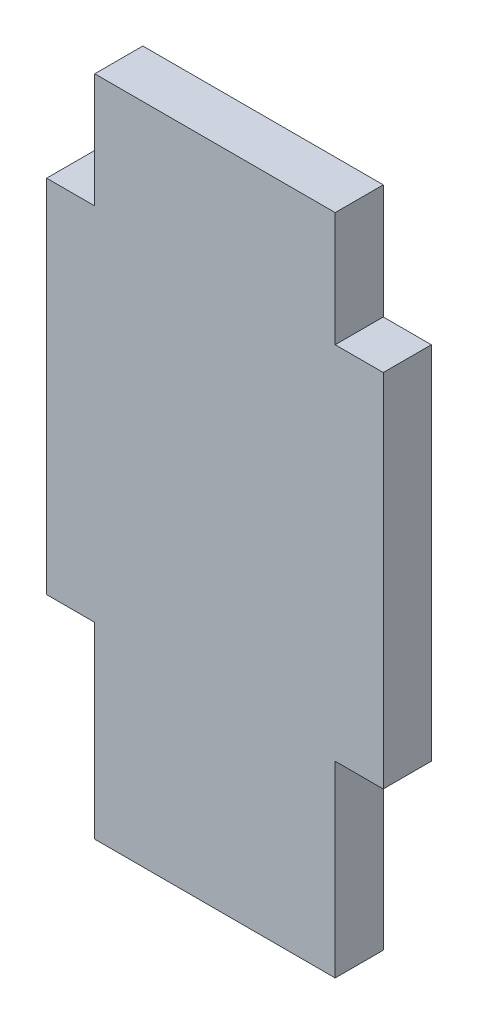
ISO-10303-21;
HEADER;
FILE_DESCRIPTION(('STEP AP214'),'2;1');
FILE_NAME('part.step','',(''),(''),'','','');
FILE_SCHEMA(('AUTOMOTIVE_DESIGN { 1 0 10303 214 1 1 1 1 }'));
ENDSEC;
DATA;
#1=APPLICATION_CONTEXT('core data for automotive mechanical design processes');
#2=APPLICATION_PROTOCOL_DEFINITION('international standard','automotive_design',2000,#1);
#3=PRODUCT_CONTEXT('',#1,'mechanical');
#4=PRODUCT('Part','Part','',(#3));
#5=PRODUCT_RELATED_PRODUCT_CATEGORY('part','',(#4));
#6=PRODUCT_DEFINITION_FORMATION('','',#4);
#7=PRODUCT_DEFINITION_CONTEXT('part definition',#1,'design');
#8=PRODUCT_DEFINITION('design','',#6,#7);
#9=PRODUCT_DEFINITION_SHAPE('','',#8);
#10=(LENGTH_UNIT() NAMED_UNIT(*) SI_UNIT(.MILLI.,.METRE.));
#11=(NAMED_UNIT(*) PLANE_ANGLE_UNIT() SI_UNIT($,.RADIAN.));
#12=(NAMED_UNIT(*) SI_UNIT($,.STERADIAN.) SOLID_ANGLE_UNIT());
#13=UNCERTAINTY_MEASURE_WITH_UNIT(LENGTH_MEASURE(1.E-05),#10,'distance_accuracy_value','');
#14=(GEOMETRIC_REPRESENTATION_CONTEXT(3) GLOBAL_UNCERTAINTY_ASSIGNED_CONTEXT((#13)) GLOBAL_UNIT_ASSIGNED_CONTEXT((#10,
#11,#12)) REPRESENTATION_CONTEXT('',''));
#15=CARTESIAN_POINT('',(0.,0.,0.));
#16=DIRECTION('',(0.,0.,1.));
#17=DIRECTION('',(1.,0.,0.));
#18=AXIS2_PLACEMENT_3D('',#15,#16,#17);
#19=CARTESIAN_POINT('',(18.1671687906472,102.945208252911,5.08));
#20=DIRECTION('',(0.,-1.,0.));
#21=DIRECTION('',(0.,0.,-1.));
#22=AXIS2_PLACEMENT_3D('',#19,#20,#21);
#23=PLANE('',#22);
#24=DIRECTION('',(-1.,0.,0.));
#25=VECTOR('',#24,1.);
#26=CARTESIAN_POINT('',(18.1671687906472,102.945208252911,0.));
#27=LINE('',#26,#25);
#28=CARTESIAN_POINT('',(18.1671687906472,102.945208252911,0.));
#29=VERTEX_POINT('',#28);
#30=CARTESIAN_POINT('',(13.0871687906472,102.945208252911,0.));
#31=VERTEX_POINT('',#30);
#32=EDGE_CURVE('E171',#29,#31,#27,.T.);
#33=ORIENTED_EDGE('',*,*,#32,.F.);
#34=DIRECTION('',(0.,0.,-1.));
#35=VECTOR('',#34,1.);
#36=CARTESIAN_POINT('',(18.1671687906472,102.945208252911,5.08));
#37=LINE('',#36,#35);
#38=CARTESIAN_POINT('',(18.1671687906472,102.945208252911,5.08));
#39=VERTEX_POINT('',#38);
#40=EDGE_CURVE('E11',#39,#29,#37,.T.);
#41=ORIENTED_EDGE('',*,*,#40,.F.);
#42=DIRECTION('',(-1.,0.,0.));
#43=VECTOR('',#42,1.);
#44=CARTESIAN_POINT('',(18.1671687906472,102.945208252911,5.08));
#45=LINE('',#44,#43);
#46=CARTESIAN_POINT('',(13.0871687906472,102.945208252911,5.08));
#47=VERTEX_POINT('',#46);
#48=EDGE_CURVE('E201',#39,#47,#45,.T.);
#49=ORIENTED_EDGE('',*,*,#48,.T.);
#50=DIRECTION('',(0.,0.,-1.));
#51=VECTOR('',#50,1.);
#52=CARTESIAN_POINT('',(13.0871687906472,102.945208252911,5.08));
#53=LINE('',#52,#51);
#54=EDGE_CURVE('E36',#47,#31,#53,.T.);
#55=ORIENTED_EDGE('',*,*,#54,.T.);
#56=EDGE_LOOP('',(#33,#41,#49,#55));
#57=FACE_BOUND('',#56,.T.);
#58=ADVANCED_FACE('F33',(#57),#23,.T.);
#59=CARTESIAN_POINT('',(18.1671687906472,95.3054468690553,5.08));
#60=DIRECTION('',(-1.,0.,0.));
#61=DIRECTION('',(0.,0.,1.));
#62=AXIS2_PLACEMENT_3D('',#59,#60,#61);
#63=PLANE('',#62);
#64=DIRECTION('',(0.,1.,0.));
#65=VECTOR('',#64,1.);
#66=CARTESIAN_POINT('',(18.1671687906472,95.3054468690553,0.));
#67=LINE('',#66,#65);
#68=CARTESIAN_POINT('',(18.1671687906472,83.1134468690553,0.));
#69=VERTEX_POINT('',#68);
#70=EDGE_CURVE('E88',#69,#29,#67,.T.);
#71=ORIENTED_EDGE('',*,*,#70,.F.);
#72=DIRECTION('',(0.,0.,-1.));
#73=VECTOR('',#72,1.);
#74=CARTESIAN_POINT('',(18.1671687906472,83.1134468690553,5.08));
#75=LINE('',#74,#73);
#76=CARTESIAN_POINT('',(18.1671687906472,83.1134468690553,5.08));
#77=VERTEX_POINT('',#76);
#78=EDGE_CURVE('E42',#77,#69,#75,.T.);
#79=ORIENTED_EDGE('',*,*,#78,.F.);
#80=DIRECTION('',(0.,-1.,0.));
#81=VECTOR('',#80,1.);
#82=CARTESIAN_POINT('',(18.1671687906472,95.3054468690553,5.08));
#83=LINE('',#82,#81);
#84=EDGE_CURVE('E50',#39,#77,#83,.T.);
#85=ORIENTED_EDGE('',*,*,#84,.F.);
#86=ORIENTED_EDGE('',*,*,#40,.T.);
#87=EDGE_LOOP('',(#71,#79,#85,#86));
#88=FACE_BOUND('',#87,.T.);
#89=ADVANCED_FACE('F258',(#88),#63,.T.);
#90=CARTESIAN_POINT('',(18.1671687906472,83.1134468690553,5.08));
#91=DIRECTION('',(0.,1.,0.));
#92=DIRECTION('',(0.,0.,1.));
#93=AXIS2_PLACEMENT_3D('',#90,#91,#92);
#94=PLANE('',#93);
#95=DIRECTION('',(1.,0.,0.));
#96=VECTOR('',#95,1.);
#97=CARTESIAN_POINT('',(18.1671687906472,83.1134468690553,0.));
#98=LINE('',#97,#96);
#99=CARTESIAN_POINT('',(43.567168790647,83.1134468690553,0.));
#100=VERTEX_POINT('',#99);
#101=EDGE_CURVE('E147',#69,#100,#98,.T.);
#102=ORIENTED_EDGE('',*,*,#101,.T.);
#103=DIRECTION('',(0.,0.,-1.));
#104=VECTOR('',#103,1.);
#105=CARTESIAN_POINT('',(43.567168790647,83.1134468690553,5.08));
#106=LINE('',#105,#104);
#107=CARTESIAN_POINT('',(43.567168790647,83.1134468690553,5.08));
#108=VERTEX_POINT('',#107);
#109=EDGE_CURVE('E130',#108,#100,#106,.T.);
#110=ORIENTED_EDGE('',*,*,#109,.F.);
#111=DIRECTION('',(1.,0.,0.));
#112=VECTOR('',#111,1.);
#113=CARTESIAN_POINT('',(18.1671687906472,83.1134468690553,5.08));
#114=LINE('',#113,#112);
#115=EDGE_CURVE('E137',#77,#108,#114,.T.);
#116=ORIENTED_EDGE('',*,*,#115,.F.);
#117=ORIENTED_EDGE('',*,*,#78,.T.);
#118=EDGE_LOOP('',(#102,#110,#116,#117));
#119=FACE_BOUND('',#118,.T.);
#120=ADVANCED_FACE('F145',(#119),#94,.F.);
#121=CARTESIAN_POINT('',(43.567168790647,83.1134468690553,5.08));
#122=DIRECTION('',(-1.,0.,0.));
#123=DIRECTION('',(0.,0.,1.));
#124=AXIS2_PLACEMENT_3D('',#121,#122,#123);
#125=PLANE('',#124);
#126=DIRECTION('',(0.,1.,0.));
#127=VECTOR('',#126,1.);
#128=CARTESIAN_POINT('',(43.567168790647,83.1134468690553,0.));
#129=LINE('',#128,#127);
#130=CARTESIAN_POINT('',(43.567168790647,102.945208252911,0.));
#131=VERTEX_POINT('',#130);
#132=EDGE_CURVE('E198',#100,#131,#129,.T.);
#133=ORIENTED_EDGE('',*,*,#132,.T.);
#134=DIRECTION('',(0.,0.,-1.));
#135=VECTOR('',#134,1.);
#136=CARTESIAN_POINT('',(43.567168790647,102.945208252911,5.08));
#137=LINE('',#136,#135);
#138=CARTESIAN_POINT('',(43.567168790647,102.945208252911,5.08));
#139=VERTEX_POINT('',#138);
#140=EDGE_CURVE('E133',#139,#131,#137,.T.);
#141=ORIENTED_EDGE('',*,*,#140,.F.);
#142=DIRECTION('',(0.,-1.,0.));
#143=VECTOR('',#142,1.);
#144=CARTESIAN_POINT('',(43.567168790647,102.945208252911,5.08));
#145=LINE('',#144,#143);
#146=EDGE_CURVE('E126',#139,#108,#145,.T.);
#147=ORIENTED_EDGE('',*,*,#146,.T.);
#148=ORIENTED_EDGE('',*,*,#109,.T.);
#149=EDGE_LOOP('',(#133,#141,#147,#148));
#150=FACE_BOUND('',#149,.T.);
#151=ADVANCED_FACE('F128',(#150),#125,.F.);
#152=CARTESIAN_POINT('',(48.647168790647,102.945208252911,5.08));
#153=DIRECTION('',(0.,-1.,0.));
#154=DIRECTION('',(0.,0.,-1.));
#155=AXIS2_PLACEMENT_3D('',#152,#153,#154);
#156=PLANE('',#155);
#157=DIRECTION('',(-1.,0.,0.));
#158=VECTOR('',#157,1.);
#159=CARTESIAN_POINT('',(48.647168790647,102.945208252911,0.));
#160=LINE('',#159,#158);
#161=CARTESIAN_POINT('',(48.647168790647,102.945208252911,0.));
#162=VERTEX_POINT('',#161);
#163=EDGE_CURVE('E195',#162,#131,#160,.T.);
#164=ORIENTED_EDGE('',*,*,#163,.F.);
#165=DIRECTION('',(0.,0.,-1.));
#166=VECTOR('',#165,1.);
#167=CARTESIAN_POINT('',(48.647168790647,102.945208252911,5.08));
#168=LINE('',#167,#166);
#169=CARTESIAN_POINT('',(48.647168790647,102.945208252911,5.08));
#170=VERTEX_POINT('',#169);
#171=EDGE_CURVE('E150',#170,#162,#168,.T.);
#172=ORIENTED_EDGE('',*,*,#171,.F.);
#173=DIRECTION('',(-1.,0.,0.));
#174=VECTOR('',#173,1.);
#175=CARTESIAN_POINT('',(48.647168790647,102.945208252911,5.08));
#176=LINE('',#175,#174);
#177=EDGE_CURVE('E138',#170,#139,#176,.T.);
#178=ORIENTED_EDGE('',*,*,#177,.T.);
#179=ORIENTED_EDGE('',*,*,#140,.T.);
#180=EDGE_LOOP('',(#164,#172,#178,#179));
#181=FACE_BOUND('',#180,.T.);
#182=ADVANCED_FACE('F225',(#181),#156,.T.);
#183=CARTESIAN_POINT('',(48.647168790647,141.045208252911,5.08));
#184=DIRECTION('',(1.,0.,0.));
#185=DIRECTION('',(0.,0.,-1.));
#186=AXIS2_PLACEMENT_3D('',#183,#184,#185);
#187=PLANE('',#186);
#188=DIRECTION('',(0.,-1.,0.));
#189=VECTOR('',#188,1.);
#190=CARTESIAN_POINT('',(48.647168790647,141.045208252911,0.));
#191=LINE('',#190,#189);
#192=CARTESIAN_POINT('',(48.647168790647,141.045208252911,0.));
#193=VERTEX_POINT('',#192);
#194=EDGE_CURVE('E192',#193,#162,#191,.T.);
#195=ORIENTED_EDGE('',*,*,#194,.F.);
#196=DIRECTION('',(0.,0.,-1.));
#197=VECTOR('',#196,1.);
#198=CARTESIAN_POINT('',(48.647168790647,141.045208252911,5.08));
#199=LINE('',#198,#197);
#200=CARTESIAN_POINT('',(48.647168790647,141.045208252911,5.08));
#201=VERTEX_POINT('',#200);
#202=EDGE_CURVE('E154',#201,#193,#199,.T.);
#203=ORIENTED_EDGE('',*,*,#202,.F.);
#204=DIRECTION('',(0.,-1.,0.));
#205=VECTOR('',#204,1.);
#206=CARTESIAN_POINT('',(48.647168790647,141.045208252911,5.08));
#207=LINE('',#206,#205);
#208=EDGE_CURVE('E220',#201,#170,#207,.T.);
#209=ORIENTED_EDGE('',*,*,#208,.T.);
#210=ORIENTED_EDGE('',*,*,#171,.T.);
#211=EDGE_LOOP('',(#195,#203,#209,#210));
#212=FACE_BOUND('',#211,.T.);
#213=ADVANCED_FACE('F229',(#212),#187,.T.);
#214=CARTESIAN_POINT('',(48.647168790647,141.045208252911,5.08));
#215=DIRECTION('',(0.,-1.,0.));
#216=DIRECTION('',(0.,0.,-1.));
#217=AXIS2_PLACEMENT_3D('',#214,#215,#216);
#218=PLANE('',#217);
#219=DIRECTION('',(-1.,0.,0.));
#220=VECTOR('',#219,1.);
#221=CARTESIAN_POINT('',(48.647168790647,141.045208252911,0.));
#222=LINE('',#221,#220);
#223=CARTESIAN_POINT('',(43.567168790647,141.045208252911,0.));
#224=VERTEX_POINT('',#223);
#225=EDGE_CURVE('E189',#193,#224,#222,.T.);
#226=ORIENTED_EDGE('',*,*,#225,.T.);
#227=DIRECTION('',(0.,0.,-1.));
#228=VECTOR('',#227,1.);
#229=CARTESIAN_POINT('',(43.567168790647,141.045208252911,5.08));
#230=LINE('',#229,#228);
#231=CARTESIAN_POINT('',(43.567168790647,141.045208252911,5.08));
#232=VERTEX_POINT('',#231);
#233=EDGE_CURVE('E156',#232,#224,#230,.T.);
#234=ORIENTED_EDGE('',*,*,#233,.F.);
#235=DIRECTION('',(-1.,0.,0.));
#236=VECTOR('',#235,1.);
#237=CARTESIAN_POINT('',(48.647168790647,141.045208252911,5.08));
#238=LINE('',#237,#236);
#239=EDGE_CURVE('E217',#201,#232,#238,.T.);
#240=ORIENTED_EDGE('',*,*,#239,.F.);
#241=ORIENTED_EDGE('',*,*,#202,.T.);
#242=EDGE_LOOP('',(#226,#234,#240,#241));
#243=FACE_BOUND('',#242,.T.);
#244=ADVANCED_FACE('F234',(#243),#218,.F.);
#245=CARTESIAN_POINT('',(43.567168790647,146.023259367157,5.08));
#246=DIRECTION('',(1.,0.,0.));
#247=DIRECTION('',(0.,0.,-1.));
#248=AXIS2_PLACEMENT_3D('',#245,#246,#247);
#249=PLANE('',#248);
#250=DIRECTION('',(0.,-1.,0.));
#251=VECTOR('',#250,1.);
#252=CARTESIAN_POINT('',(43.567168790647,146.023259367157,0.));
#253=LINE('',#252,#251);
#254=CARTESIAN_POINT('',(43.567168790647,153.135259367157,0.));
#255=VERTEX_POINT('',#254);
#256=EDGE_CURVE('E186',#255,#224,#253,.T.);
#257=ORIENTED_EDGE('',*,*,#256,.F.);
#258=DIRECTION('',(0.,0.,-1.));
#259=VECTOR('',#258,1.);
#260=CARTESIAN_POINT('',(43.567168790647,153.135259367157,5.08));
#261=LINE('',#260,#259);
#262=CARTESIAN_POINT('',(43.567168790647,153.135259367157,5.08));
#263=VERTEX_POINT('',#262);
#264=EDGE_CURVE('E158',#263,#255,#261,.T.);
#265=ORIENTED_EDGE('',*,*,#264,.F.);
#266=DIRECTION('',(0.,-1.,0.));
#267=VECTOR('',#266,1.);
#268=CARTESIAN_POINT('',(43.567168790647,153.135259367157,5.08));
#269=LINE('',#268,#267);
#270=EDGE_CURVE('E215',#263,#232,#269,.T.);
#271=ORIENTED_EDGE('',*,*,#270,.T.);
#272=ORIENTED_EDGE('',*,*,#233,.T.);
#273=EDGE_LOOP('',(#257,#265,#271,#272));
#274=FACE_BOUND('',#273,.T.);
#275=ADVANCED_FACE('F277',(#274),#249,.T.);
#276=CARTESIAN_POINT('',(18.1671687906472,153.135259367157,5.08));
#277=DIRECTION('',(0.,1.,0.));
#278=DIRECTION('',(0.,0.,1.));
#279=AXIS2_PLACEMENT_3D('',#276,#277,#278);
#280=PLANE('',#279);
#281=DIRECTION('',(1.,0.,0.));
#282=VECTOR('',#281,1.);
#283=CARTESIAN_POINT('',(18.1671687906472,153.135259367157,0.));
#284=LINE('',#283,#282);
#285=CARTESIAN_POINT('',(18.1671687906472,153.135259367157,0.));
#286=VERTEX_POINT('',#285);
#287=EDGE_CURVE('E183',#286,#255,#284,.T.);
#288=ORIENTED_EDGE('',*,*,#287,.F.);
#289=DIRECTION('',(0.,0.,-1.));
#290=VECTOR('',#289,1.);
#291=CARTESIAN_POINT('',(18.1671687906472,153.135259367157,5.08));
#292=LINE('',#291,#290);
#293=CARTESIAN_POINT('',(18.1671687906472,153.135259367157,5.08));
#294=VERTEX_POINT('',#293);
#295=EDGE_CURVE('E161',#294,#286,#292,.T.);
#296=ORIENTED_EDGE('',*,*,#295,.F.);
#297=DIRECTION('',(1.,0.,0.));
#298=VECTOR('',#297,1.);
#299=CARTESIAN_POINT('',(18.1671687906472,153.135259367157,5.08));
#300=LINE('',#299,#298);
#301=EDGE_CURVE('E212',#294,#263,#300,.T.);
#302=ORIENTED_EDGE('',*,*,#301,.T.);
#303=ORIENTED_EDGE('',*,*,#264,.T.);
#304=EDGE_LOOP('',(#288,#296,#302,#303));
#305=FACE_BOUND('',#304,.T.);
#306=ADVANCED_FACE('F242',(#305),#280,.T.);
#307=CARTESIAN_POINT('',(18.1671687906472,146.023259367157,5.08));
#308=DIRECTION('',(-1.,0.,0.));
#309=DIRECTION('',(0.,0.,1.));
#310=AXIS2_PLACEMENT_3D('',#307,#308,#309);
#311=PLANE('',#310);
#312=DIRECTION('',(0.,1.,0.));
#313=VECTOR('',#312,1.);
#314=CARTESIAN_POINT('',(18.1671687906472,146.023259367157,0.));
#315=LINE('',#314,#313);
#316=CARTESIAN_POINT('',(18.1671687906472,141.045208252911,0.));
#317=VERTEX_POINT('',#316);
#318=EDGE_CURVE('E180',#317,#286,#315,.T.);
#319=ORIENTED_EDGE('',*,*,#318,.F.);
#320=DIRECTION('',(0.,0.,-1.));
#321=VECTOR('',#320,1.);
#322=CARTESIAN_POINT('',(18.1671687906472,141.045208252911,5.08));
#323=LINE('',#322,#321);
#324=CARTESIAN_POINT('',(18.1671687906472,141.045208252911,5.08));
#325=VERTEX_POINT('',#324);
#326=EDGE_CURVE('E163',#325,#317,#323,.T.);
#327=ORIENTED_EDGE('',*,*,#326,.F.);
#328=DIRECTION('',(0.,1.,0.));
#329=VECTOR('',#328,1.);
#330=CARTESIAN_POINT('',(18.1671687906472,141.045208252911,5.08));
#331=LINE('',#330,#329);
#332=EDGE_CURVE('E210',#325,#294,#331,.T.);
#333=ORIENTED_EDGE('',*,*,#332,.T.);
#334=ORIENTED_EDGE('',*,*,#295,.T.);
#335=EDGE_LOOP('',(#319,#327,#333,#334));
#336=FACE_BOUND('',#335,.T.);
#337=ADVANCED_FACE('F244',(#336),#311,.T.);
#338=CARTESIAN_POINT('',(13.0871687906472,141.045208252911,5.08));
#339=DIRECTION('',(0.,1.,0.));
#340=DIRECTION('',(0.,0.,1.));
#341=AXIS2_PLACEMENT_3D('',#338,#339,#340);
#342=PLANE('',#341);
#343=DIRECTION('',(1.,0.,0.));
#344=VECTOR('',#343,1.);
#345=CARTESIAN_POINT('',(13.0871687906472,141.045208252911,0.));
#346=LINE('',#345,#344);
#347=CARTESIAN_POINT('',(13.0871687906472,141.045208252911,0.));
#348=VERTEX_POINT('',#347);
#349=EDGE_CURVE('E177',#348,#317,#346,.T.);
#350=ORIENTED_EDGE('',*,*,#349,.F.);
#351=DIRECTION('',(0.,0.,-1.));
#352=VECTOR('',#351,1.);
#353=CARTESIAN_POINT('',(13.0871687906472,141.045208252911,5.08));
#354=LINE('',#353,#352);
#355=CARTESIAN_POINT('',(13.0871687906472,141.045208252911,5.08));
#356=VERTEX_POINT('',#355);
#357=EDGE_CURVE('E165',#356,#348,#354,.T.);
#358=ORIENTED_EDGE('',*,*,#357,.F.);
#359=DIRECTION('',(1.,0.,0.));
#360=VECTOR('',#359,1.);
#361=CARTESIAN_POINT('',(13.0871687906472,141.045208252911,5.08));
#362=LINE('',#361,#360);
#363=EDGE_CURVE('E205',#356,#325,#362,.T.);
#364=ORIENTED_EDGE('',*,*,#363,.T.);
#365=ORIENTED_EDGE('',*,*,#326,.T.);
#366=EDGE_LOOP('',(#350,#358,#364,#365));
#367=FACE_BOUND('',#366,.T.);
#368=ADVANCED_FACE('F247',(#367),#342,.T.);
#369=CARTESIAN_POINT('',(13.0871687906472,102.945208252911,5.08));
#370=DIRECTION('',(-1.,0.,0.));
#371=DIRECTION('',(0.,0.,1.));
#372=AXIS2_PLACEMENT_3D('',#369,#370,#371);
#373=PLANE('',#372);
#374=DIRECTION('',(0.,1.,0.));
#375=VECTOR('',#374,1.);
#376=CARTESIAN_POINT('',(13.0871687906472,102.945208252911,0.));
#377=LINE('',#376,#375);
#378=EDGE_CURVE('E174',#31,#348,#377,.T.);
#379=ORIENTED_EDGE('',*,*,#378,.F.);
#380=ORIENTED_EDGE('',*,*,#54,.F.);
#381=DIRECTION('',(0.,1.,0.));
#382=VECTOR('',#381,1.);
#383=CARTESIAN_POINT('',(13.0871687906472,102.945208252911,5.08));
#384=LINE('',#383,#382);
#385=EDGE_CURVE('E203',#47,#356,#384,.T.);
#386=ORIENTED_EDGE('',*,*,#385,.T.);
#387=ORIENTED_EDGE('',*,*,#357,.T.);
#388=EDGE_LOOP('',(#379,#380,#386,#387));
#389=FACE_BOUND('',#388,.T.);
#390=ADVANCED_FACE('F249',(#389),#373,.T.);
#391=CARTESIAN_POINT('',(0.,0.,5.08));
#392=DIRECTION('',(0.,0.,-1.));
#393=DIRECTION('',(-1.,0.,0.));
#394=AXIS2_PLACEMENT_3D('',#391,#392,#393);
#395=PLANE('',#394);
#396=ORIENTED_EDGE('',*,*,#48,.F.);
#397=ORIENTED_EDGE('',*,*,#84,.T.);
#398=ORIENTED_EDGE('',*,*,#115,.T.);
#399=ORIENTED_EDGE('',*,*,#146,.F.);
#400=ORIENTED_EDGE('',*,*,#177,.F.);
#401=ORIENTED_EDGE('',*,*,#208,.F.);
#402=ORIENTED_EDGE('',*,*,#239,.T.);
#403=ORIENTED_EDGE('',*,*,#270,.F.);
#404=ORIENTED_EDGE('',*,*,#301,.F.);
#405=ORIENTED_EDGE('',*,*,#332,.F.);
#406=ORIENTED_EDGE('',*,*,#363,.F.);
#407=ORIENTED_EDGE('',*,*,#385,.F.);
#408=EDGE_LOOP('',(#396,#397,#398,#399,#400,#401,#402,#403,#404,#405,#406,#407));
#409=FACE_BOUND('',#408,.T.);
#410=ADVANCED_FACE('F142',(#409),#395,.F.);
#411=CARTESIAN_POINT('',(0.,0.,0.));
#412=DIRECTION('',(0.,0.,-1.));
#413=DIRECTION('',(-1.,0.,0.));
#414=AXIS2_PLACEMENT_3D('',#411,#412,#413);
#415=PLANE('',#414);
#416=ORIENTED_EDGE('',*,*,#32,.T.);
#417=ORIENTED_EDGE('',*,*,#378,.T.);
#418=ORIENTED_EDGE('',*,*,#349,.T.);
#419=ORIENTED_EDGE('',*,*,#318,.T.);
#420=ORIENTED_EDGE('',*,*,#287,.T.);
#421=ORIENTED_EDGE('',*,*,#256,.T.);
#422=ORIENTED_EDGE('',*,*,#225,.F.);
#423=ORIENTED_EDGE('',*,*,#194,.T.);
#424=ORIENTED_EDGE('',*,*,#163,.T.);
#425=ORIENTED_EDGE('',*,*,#132,.F.);
#426=ORIENTED_EDGE('',*,*,#101,.F.);
#427=ORIENTED_EDGE('',*,*,#70,.T.);
#428=EDGE_LOOP('',(#416,#417,#418,#419,#420,#421,#422,#423,#424,#425,#426,#427));
#429=FACE_BOUND('',#428,.T.);
#430=ADVANCED_FACE('F248',(#429),#415,.T.);
#431=CLOSED_SHELL('',(#58,#89,#120,#151,#182,#213,#244,#275,#306,#337,#368,#390,#410,#430));
#432=MANIFOLD_SOLID_BREP('B2',#431);
#433=ADVANCED_BREP_SHAPE_REPRESENTATION('',(#18,#432),#14);
#434=SHAPE_DEFINITION_REPRESENTATION(#9,#433);
ENDSEC;
END-ISO-10303-21;
